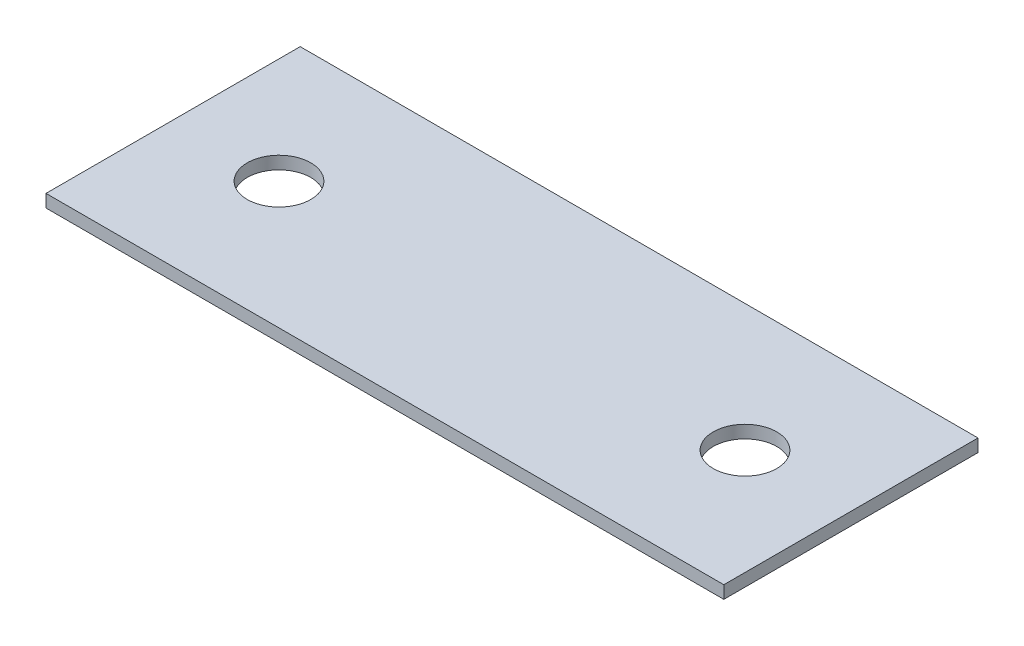
ISO-10303-21;
HEADER;
FILE_DESCRIPTION(('STEP AP214'),'2;1');
FILE_NAME('part.step','',(''),(''),'','','');
FILE_SCHEMA(('AUTOMOTIVE_DESIGN { 1 0 10303 214 1 1 1 1 }'));
ENDSEC;
DATA;
#1=APPLICATION_CONTEXT('core data for automotive mechanical design processes');
#2=APPLICATION_PROTOCOL_DEFINITION('international standard','automotive_design',2000,#1);
#3=PRODUCT_CONTEXT('',#1,'mechanical');
#4=PRODUCT('Part','Part','',(#3));
#5=PRODUCT_RELATED_PRODUCT_CATEGORY('part','',(#4));
#6=PRODUCT_DEFINITION_FORMATION('','',#4);
#7=PRODUCT_DEFINITION_CONTEXT('part definition',#1,'design');
#8=PRODUCT_DEFINITION('design','',#6,#7);
#9=PRODUCT_DEFINITION_SHAPE('','',#8);
#10=(LENGTH_UNIT() NAMED_UNIT(*) SI_UNIT(.MILLI.,.METRE.));
#11=(NAMED_UNIT(*) PLANE_ANGLE_UNIT() SI_UNIT($,.RADIAN.));
#12=(NAMED_UNIT(*) SI_UNIT($,.STERADIAN.) SOLID_ANGLE_UNIT());
#13=UNCERTAINTY_MEASURE_WITH_UNIT(LENGTH_MEASURE(1.E-05),#10,'distance_accuracy_value','');
#14=(GEOMETRIC_REPRESENTATION_CONTEXT(3) GLOBAL_UNCERTAINTY_ASSIGNED_CONTEXT((#13)) GLOBAL_UNIT_ASSIGNED_CONTEXT((#10,
#11,#12)) REPRESENTATION_CONTEXT('',''));
#15=CARTESIAN_POINT('',(0.,0.,0.));
#16=DIRECTION('',(0.,0.,1.));
#17=DIRECTION('',(1.,0.,0.));
#18=AXIS2_PLACEMENT_3D('',#15,#16,#17);
#19=CARTESIAN_POINT('',(0.,3.,0.));
#20=DIRECTION('',(0.,1.,0.));
#21=DIRECTION('',(0.,0.,1.));
#22=AXIS2_PLACEMENT_3D('',#19,#20,#21);
#23=PLANE('',#22);
#24=CARTESIAN_POINT('',(55.,3.,0.));
#25=DIRECTION('',(0.,1.,0.));
#26=DIRECTION('',(0.,0.,1.));
#27=AXIS2_PLACEMENT_3D('',#24,#25,#26);
#28=CIRCLE('',#27,7.50000000000001);
#29=CARTESIAN_POINT('',(55.,3.,7.50000000000001));
#30=VERTEX_POINT('',#29);
#31=EDGE_CURVE('E101',#30,#30,#28,.T.);
#32=ORIENTED_EDGE('',*,*,#31,.F.);
#33=EDGE_LOOP('',(#32));
#34=FACE_BOUND('',#33,.T.);
#35=DIRECTION('',(0.,0.,-1.));
#36=VECTOR('',#35,1.);
#37=CARTESIAN_POINT('',(80.,3.,-30.));
#38=LINE('',#37,#36);
#39=CARTESIAN_POINT('',(80.,3.,30.));
#40=VERTEX_POINT('',#39);
#41=CARTESIAN_POINT('',(80.,3.,-30.));
#42=VERTEX_POINT('',#41);
#43=EDGE_CURVE('E86',#40,#42,#38,.T.);
#44=ORIENTED_EDGE('',*,*,#43,.T.);
#45=DIRECTION('',(-1.,0.,0.));
#46=VECTOR('',#45,1.);
#47=CARTESIAN_POINT('',(-80.,3.,-30.));
#48=LINE('',#47,#46);
#49=CARTESIAN_POINT('',(-80.,3.,-30.));
#50=VERTEX_POINT('',#49);
#51=EDGE_CURVE('E81',#42,#50,#48,.T.);
#52=ORIENTED_EDGE('',*,*,#51,.T.);
#53=DIRECTION('',(0.,0.,1.));
#54=VECTOR('',#53,1.);
#55=CARTESIAN_POINT('',(-80.,3.,-30.));
#56=LINE('',#55,#54);
#57=CARTESIAN_POINT('',(-80.,3.,30.));
#58=VERTEX_POINT('',#57);
#59=EDGE_CURVE('E84',#50,#58,#56,.T.);
#60=ORIENTED_EDGE('',*,*,#59,.T.);
#61=DIRECTION('',(1.,0.,0.));
#62=VECTOR('',#61,1.);
#63=CARTESIAN_POINT('',(-80.,3.,30.));
#64=LINE('',#63,#62);
#65=EDGE_CURVE('E51',#58,#40,#64,.T.);
#66=ORIENTED_EDGE('',*,*,#65,.T.);
#67=EDGE_LOOP('',(#44,#52,#60,#66));
#68=FACE_BOUND('',#67,.T.);
#69=CARTESIAN_POINT('',(-55.,3.,0.));
#70=DIRECTION('',(0.,1.,0.));
#71=DIRECTION('',(0.,0.,1.));
#72=AXIS2_PLACEMENT_3D('',#69,#70,#71);
#73=CIRCLE('',#72,7.5);
#74=CARTESIAN_POINT('',(-55.,3.,7.5));
#75=VERTEX_POINT('',#74);
#76=EDGE_CURVE('E116',#75,#75,#73,.T.);
#77=ORIENTED_EDGE('',*,*,#76,.F.);
#78=EDGE_LOOP('',(#77));
#79=FACE_BOUND('',#78,.T.);
#80=ADVANCED_FACE('F34',(#34,#68,#79),#23,.T.);
#81=CARTESIAN_POINT('',(0.,0.,0.));
#82=DIRECTION('',(0.,1.,0.));
#83=DIRECTION('',(0.,0.,1.));
#84=AXIS2_PLACEMENT_3D('',#81,#82,#83);
#85=PLANE('',#84);
#86=DIRECTION('',(0.,0.,-1.));
#87=VECTOR('',#86,1.);
#88=CARTESIAN_POINT('',(80.,0.,-30.));
#89=LINE('',#88,#87);
#90=CARTESIAN_POINT('',(80.,0.,30.));
#91=VERTEX_POINT('',#90);
#92=CARTESIAN_POINT('',(80.,0.,-30.));
#93=VERTEX_POINT('',#92);
#94=EDGE_CURVE('E98',#91,#93,#89,.T.);
#95=ORIENTED_EDGE('',*,*,#94,.F.);
#96=DIRECTION('',(1.,0.,0.));
#97=VECTOR('',#96,1.);
#98=CARTESIAN_POINT('',(-80.,0.,30.));
#99=LINE('',#98,#97);
#100=CARTESIAN_POINT('',(-80.,0.,30.));
#101=VERTEX_POINT('',#100);
#102=EDGE_CURVE('E74',#101,#91,#99,.T.);
#103=ORIENTED_EDGE('',*,*,#102,.F.);
#104=DIRECTION('',(0.,0.,1.));
#105=VECTOR('',#104,1.);
#106=CARTESIAN_POINT('',(-80.,0.,-30.));
#107=LINE('',#106,#105);
#108=CARTESIAN_POINT('',(-80.,0.,-30.));
#109=VERTEX_POINT('',#108);
#110=EDGE_CURVE('E68',#109,#101,#107,.T.);
#111=ORIENTED_EDGE('',*,*,#110,.F.);
#112=DIRECTION('',(-1.,0.,0.));
#113=VECTOR('',#112,1.);
#114=CARTESIAN_POINT('',(-80.,0.,-30.));
#115=LINE('',#114,#113);
#116=EDGE_CURVE('E90',#93,#109,#115,.T.);
#117=ORIENTED_EDGE('',*,*,#116,.F.);
#118=EDGE_LOOP('',(#95,#103,#111,#117));
#119=FACE_BOUND('',#118,.T.);
#120=CARTESIAN_POINT('',(55.,0.,0.));
#121=DIRECTION('',(0.,1.,0.));
#122=DIRECTION('',(0.,0.,1.));
#123=AXIS2_PLACEMENT_3D('',#120,#121,#122);
#124=CIRCLE('',#123,7.50000000000001);
#125=CARTESIAN_POINT('',(55.,0.,7.50000000000001));
#126=VERTEX_POINT('',#125);
#127=EDGE_CURVE('E113',#126,#126,#124,.T.);
#128=ORIENTED_EDGE('',*,*,#127,.T.);
#129=EDGE_LOOP('',(#128));
#130=FACE_BOUND('',#129,.T.);
#131=CARTESIAN_POINT('',(-55.,0.,0.));
#132=DIRECTION('',(0.,1.,0.));
#133=DIRECTION('',(0.,0.,1.));
#134=AXIS2_PLACEMENT_3D('',#131,#132,#133);
#135=CIRCLE('',#134,7.5);
#136=CARTESIAN_POINT('',(-55.,0.,7.5));
#137=VERTEX_POINT('',#136);
#138=EDGE_CURVE('E119',#137,#137,#135,.T.);
#139=ORIENTED_EDGE('',*,*,#138,.T.);
#140=EDGE_LOOP('',(#139));
#141=FACE_BOUND('',#140,.T.);
#142=ADVANCED_FACE('F109',(#119,#130,#141),#85,.F.);
#143=CARTESIAN_POINT('',(80.,3.,-30.));
#144=DIRECTION('',(-1.,0.,0.));
#145=DIRECTION('',(0.,0.,1.));
#146=AXIS2_PLACEMENT_3D('',#143,#144,#145);
#147=PLANE('',#146);
#148=ORIENTED_EDGE('',*,*,#94,.T.);
#149=DIRECTION('',(0.,-1.,0.));
#150=VECTOR('',#149,1.);
#151=CARTESIAN_POINT('',(80.,3.,-30.));
#152=LINE('',#151,#150);
#153=EDGE_CURVE('E11',#42,#93,#152,.T.);
#154=ORIENTED_EDGE('',*,*,#153,.F.);
#155=ORIENTED_EDGE('',*,*,#43,.F.);
#156=DIRECTION('',(0.,-1.,0.));
#157=VECTOR('',#156,1.);
#158=CARTESIAN_POINT('',(80.,3.,30.));
#159=LINE('',#158,#157);
#160=EDGE_CURVE('E94',#40,#91,#159,.T.);
#161=ORIENTED_EDGE('',*,*,#160,.T.);
#162=EDGE_LOOP('',(#148,#154,#155,#161));
#163=FACE_BOUND('',#162,.T.);
#164=ADVANCED_FACE('F36',(#163),#147,.F.);
#165=CARTESIAN_POINT('',(-80.,3.,-30.));
#166=DIRECTION('',(0.,0.,1.));
#167=DIRECTION('',(1.,0.,0.));
#168=AXIS2_PLACEMENT_3D('',#165,#166,#167);
#169=PLANE('',#168);
#170=ORIENTED_EDGE('',*,*,#116,.T.);
#171=DIRECTION('',(0.,-1.,0.));
#172=VECTOR('',#171,1.);
#173=CARTESIAN_POINT('',(-80.,3.,-30.));
#174=LINE('',#173,#172);
#175=EDGE_CURVE('E43',#50,#109,#174,.T.);
#176=ORIENTED_EDGE('',*,*,#175,.F.);
#177=ORIENTED_EDGE('',*,*,#51,.F.);
#178=ORIENTED_EDGE('',*,*,#153,.T.);
#179=EDGE_LOOP('',(#170,#176,#177,#178));
#180=FACE_BOUND('',#179,.T.);
#181=ADVANCED_FACE('F89',(#180),#169,.F.);
#182=CARTESIAN_POINT('',(-80.,3.,-30.));
#183=DIRECTION('',(1.,0.,0.));
#184=DIRECTION('',(0.,0.,-1.));
#185=AXIS2_PLACEMENT_3D('',#182,#183,#184);
#186=PLANE('',#185);
#187=ORIENTED_EDGE('',*,*,#110,.T.);
#188=DIRECTION('',(0.,-1.,0.));
#189=VECTOR('',#188,1.);
#190=CARTESIAN_POINT('',(-80.,3.,30.));
#191=LINE('',#190,#189);
#192=EDGE_CURVE('E91',#58,#101,#191,.T.);
#193=ORIENTED_EDGE('',*,*,#192,.F.);
#194=ORIENTED_EDGE('',*,*,#59,.F.);
#195=ORIENTED_EDGE('',*,*,#175,.T.);
#196=EDGE_LOOP('',(#187,#193,#194,#195));
#197=FACE_BOUND('',#196,.T.);
#198=ADVANCED_FACE('F92',(#197),#186,.F.);
#199=CARTESIAN_POINT('',(-80.,3.,30.));
#200=DIRECTION('',(0.,0.,-1.));
#201=DIRECTION('',(-1.,0.,0.));
#202=AXIS2_PLACEMENT_3D('',#199,#200,#201);
#203=PLANE('',#202);
#204=ORIENTED_EDGE('',*,*,#102,.T.);
#205=ORIENTED_EDGE('',*,*,#160,.F.);
#206=ORIENTED_EDGE('',*,*,#65,.F.);
#207=ORIENTED_EDGE('',*,*,#192,.T.);
#208=EDGE_LOOP('',(#204,#205,#206,#207));
#209=FACE_BOUND('',#208,.T.);
#210=ADVANCED_FACE('F106',(#209),#203,.F.);
#211=CARTESIAN_POINT('',(55.,3.,0.));
#212=DIRECTION('',(0.,-1.,0.));
#213=DIRECTION('',(0.,0.,-1.));
#214=AXIS2_PLACEMENT_3D('',#211,#212,#213);
#215=CYLINDRICAL_SURFACE('',#214,7.50000000000001);
#216=ORIENTED_EDGE('',*,*,#31,.T.);
#217=EDGE_LOOP('',(#216));
#218=FACE_BOUND('',#217,.T.);
#219=ORIENTED_EDGE('',*,*,#127,.F.);
#220=EDGE_LOOP('',(#219));
#221=FACE_BOUND('',#220,.T.);
#222=ADVANCED_FACE('F136',(#218,#221),#215,.F.);
#223=CARTESIAN_POINT('',(-55.,3.,0.));
#224=DIRECTION('',(0.,-1.,0.));
#225=DIRECTION('',(0.,0.,-1.));
#226=AXIS2_PLACEMENT_3D('',#223,#224,#225);
#227=CYLINDRICAL_SURFACE('',#226,7.5);
#228=ORIENTED_EDGE('',*,*,#76,.T.);
#229=EDGE_LOOP('',(#228));
#230=FACE_BOUND('',#229,.T.);
#231=ORIENTED_EDGE('',*,*,#138,.F.);
#232=EDGE_LOOP('',(#231));
#233=FACE_BOUND('',#232,.T.);
#234=ADVANCED_FACE('F125',(#230,#233),#227,.F.);
#235=CLOSED_SHELL('',(#80,#142,#164,#181,#198,#210,#222,#234));
#236=MANIFOLD_SOLID_BREP('B2',#235);
#237=ADVANCED_BREP_SHAPE_REPRESENTATION('',(#18,#236),#14);
#238=SHAPE_DEFINITION_REPRESENTATION(#9,#237);
ENDSEC;
END-ISO-10303-21;
